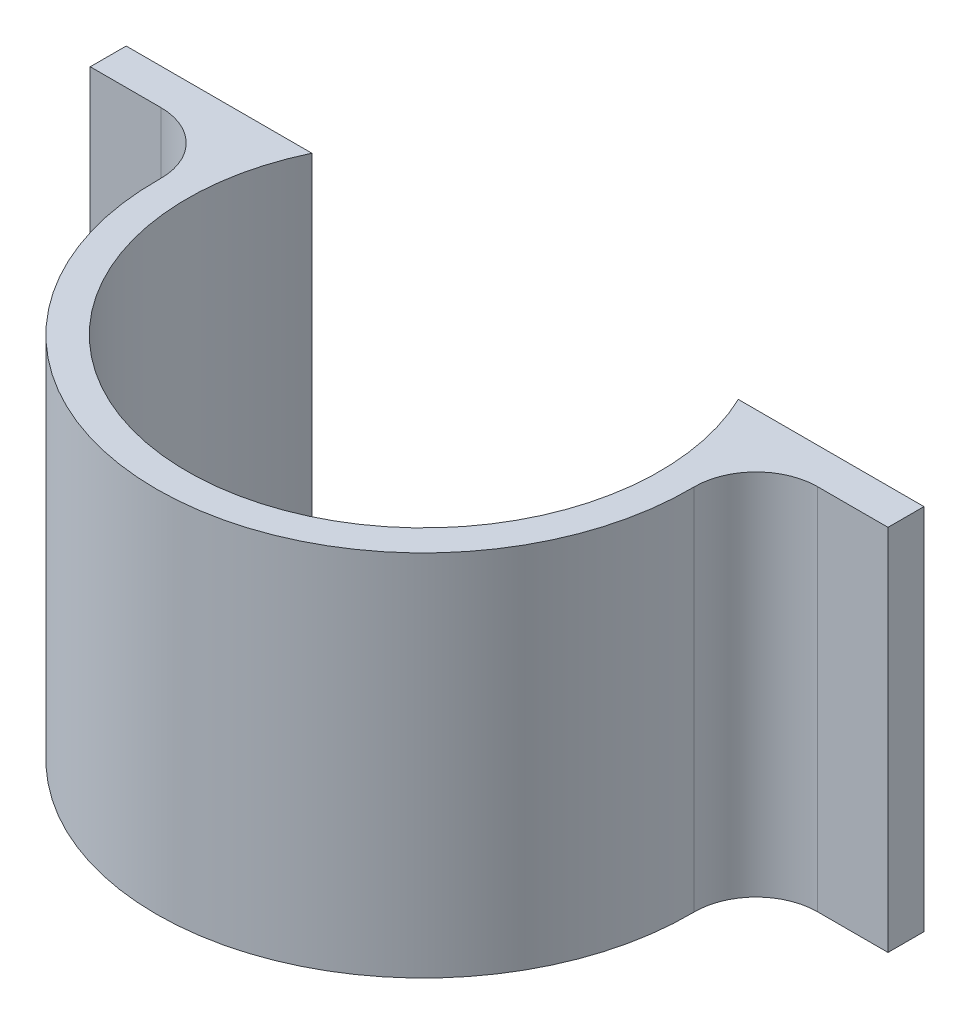
ISO-10303-21;
HEADER;
FILE_DESCRIPTION(('STEP AP214'),'2;1');
FILE_NAME('part.step','',(''),(''),'','','');
FILE_SCHEMA(('AUTOMOTIVE_DESIGN { 1 0 10303 214 1 1 1 1 }'));
ENDSEC;
DATA;
#1=APPLICATION_CONTEXT('core data for automotive mechanical design processes');
#2=APPLICATION_PROTOCOL_DEFINITION('international standard','automotive_design',2000,#1);
#3=PRODUCT_CONTEXT('',#1,'mechanical');
#4=PRODUCT('Part','Part','',(#3));
#5=PRODUCT_RELATED_PRODUCT_CATEGORY('part','',(#4));
#6=PRODUCT_DEFINITION_FORMATION('','',#4);
#7=PRODUCT_DEFINITION_CONTEXT('part definition',#1,'design');
#8=PRODUCT_DEFINITION('design','',#6,#7);
#9=PRODUCT_DEFINITION_SHAPE('','',#8);
#10=(LENGTH_UNIT() NAMED_UNIT(*) SI_UNIT(.MILLI.,.METRE.));
#11=(NAMED_UNIT(*) PLANE_ANGLE_UNIT() SI_UNIT($,.RADIAN.));
#12=(NAMED_UNIT(*) SI_UNIT($,.STERADIAN.) SOLID_ANGLE_UNIT());
#13=UNCERTAINTY_MEASURE_WITH_UNIT(LENGTH_MEASURE(1.E-05),#10,'distance_accuracy_value','');
#14=(GEOMETRIC_REPRESENTATION_CONTEXT(3) GLOBAL_UNCERTAINTY_ASSIGNED_CONTEXT((#13)) GLOBAL_UNIT_ASSIGNED_CONTEXT((#10,
#11,#12)) REPRESENTATION_CONTEXT('',''));
#15=CARTESIAN_POINT('',(0.,0.,0.));
#16=DIRECTION('',(0.,0.,1.));
#17=DIRECTION('',(1.,0.,0.));
#18=AXIS2_PLACEMENT_3D('',#15,#16,#17);
#19=CARTESIAN_POINT('',(0.,60.,-10.7115764139905));
#20=DIRECTION('',(0.,0.,-1.));
#21=DIRECTION('',(-1.,0.,0.));
#22=AXIS2_PLACEMENT_3D('',#19,#20,#21);
#23=PLANE('',#22);
#24=DIRECTION('',(1.,0.,0.));
#25=VECTOR('',#24,1.);
#26=CARTESIAN_POINT('',(0.,0.,-10.7115764139905));
#27=LINE('',#26,#25);
#28=CARTESIAN_POINT('',(-65.,0.,-10.7115764139905));
#29=VERTEX_POINT('',#28);
#30=CARTESIAN_POINT('',(-53.4952676318854,0.,-10.7115764139905));
#31=VERTEX_POINT('',#30);
#32=EDGE_CURVE('E160',#29,#31,#27,.T.);
#33=ORIENTED_EDGE('',*,*,#32,.T.);
#34=DIRECTION('',(0.,1.,0.));
#35=VECTOR('',#34,1.);
#36=CARTESIAN_POINT('',(-53.4952676318854,60.,-10.7115764139905));
#37=LINE('',#36,#35);
#38=CARTESIAN_POINT('',(-53.4952676318854,60.,-10.7115764139905));
#39=VERTEX_POINT('',#38);
#40=EDGE_CURVE('E209',#31,#39,#37,.T.);
#41=ORIENTED_EDGE('',*,*,#40,.T.);
#42=DIRECTION('',(1.,0.,0.));
#43=VECTOR('',#42,1.);
#44=CARTESIAN_POINT('',(0.,60.,-10.7115764139905));
#45=LINE('',#44,#43);
#46=CARTESIAN_POINT('',(-65.,60.,-10.7115764139905));
#47=VERTEX_POINT('',#46);
#48=EDGE_CURVE('E188',#47,#39,#45,.T.);
#49=ORIENTED_EDGE('',*,*,#48,.F.);
#50=DIRECTION('',(0.,-1.,0.));
#51=VECTOR('',#50,1.);
#52=CARTESIAN_POINT('',(-65.,60.,-10.7115764139905));
#53=LINE('',#52,#51);
#54=EDGE_CURVE('E159',#47,#29,#53,.T.);
#55=ORIENTED_EDGE('',*,*,#54,.T.);
#56=EDGE_LOOP('',(#33,#41,#49,#55));
#57=FACE_BOUND('',#56,.T.);
#58=ADVANCED_FACE('F41',(#57),#23,.F.);
#59=CARTESIAN_POINT('',(0.,60.,0.));
#60=DIRECTION('',(0.,-1.,0.));
#61=DIRECTION('',(0.,0.,-1.));
#62=AXIS2_PLACEMENT_3D('',#59,#60,#61);
#63=CYLINDRICAL_SURFACE('',#62,43.5);
#64=CARTESIAN_POINT('',(0.,60.,0.));
#65=DIRECTION('',(0.,1.,0.));
#66=DIRECTION('',(0.,0.,1.));
#67=AXIS2_PLACEMENT_3D('',#64,#65,#66);
#68=CIRCLE('',#67,43.5);
#69=CARTESIAN_POINT('',(-43.4961521866732,60.,-0.578571476796043));
#70=VERTEX_POINT('',#69);
#71=CARTESIAN_POINT('',(43.4961521866732,60.,-0.578571476796059));
#72=VERTEX_POINT('',#71);
#73=EDGE_CURVE('E126',#70,#72,#68,.T.);
#74=ORIENTED_EDGE('',*,*,#73,.F.);
#75=DIRECTION('',(0.,-1.,0.));
#76=VECTOR('',#75,1.);
#77=CARTESIAN_POINT('',(-43.4961521866732,60.,-0.578571476796043));
#78=LINE('',#77,#76);
#79=CARTESIAN_POINT('',(-43.4961521866732,0.,-0.578571476796043));
#80=VERTEX_POINT('',#79);
#81=EDGE_CURVE('E205',#70,#80,#78,.T.);
#82=ORIENTED_EDGE('',*,*,#81,.T.);
#83=CARTESIAN_POINT('',(0.,0.,0.));
#84=DIRECTION('',(0.,1.,0.));
#85=DIRECTION('',(0.,0.,1.));
#86=AXIS2_PLACEMENT_3D('',#83,#84,#85);
#87=CIRCLE('',#86,43.5);
#88=CARTESIAN_POINT('',(43.4961521866732,0.,-0.578571476796059));
#89=VERTEX_POINT('',#88);
#90=EDGE_CURVE('E164',#80,#89,#87,.T.);
#91=ORIENTED_EDGE('',*,*,#90,.T.);
#92=DIRECTION('',(0.,-1.,0.));
#93=VECTOR('',#92,1.);
#94=CARTESIAN_POINT('',(43.4961521866732,60.,-0.578571476796059));
#95=LINE('',#94,#93);
#96=EDGE_CURVE('E137',#89,#72,#95,.F.);
#97=ORIENTED_EDGE('',*,*,#96,.T.);
#98=EDGE_LOOP('',(#74,#82,#91,#97));
#99=FACE_BOUND('',#98,.T.);
#100=ADVANCED_FACE('F227',(#99),#63,.T.);
#101=CARTESIAN_POINT('',(0.,60.,-10.7115764139905));
#102=DIRECTION('',(0.,0.,-1.));
#103=DIRECTION('',(-1.,0.,0.));
#104=AXIS2_PLACEMENT_3D('',#101,#102,#103);
#105=PLANE('',#104);
#106=DIRECTION('',(1.,0.,0.));
#107=VECTOR('',#106,1.);
#108=CARTESIAN_POINT('',(0.,60.,-10.7115764139905));
#109=LINE('',#108,#107);
#110=CARTESIAN_POINT('',(53.4952676318854,60.,-10.7115764139906));
#111=VERTEX_POINT('',#110);
#112=CARTESIAN_POINT('',(65.,60.,-10.7115764139906));
#113=VERTEX_POINT('',#112);
#114=EDGE_CURVE('E116',#111,#113,#109,.T.);
#115=ORIENTED_EDGE('',*,*,#114,.F.);
#116=DIRECTION('',(0.,1.,0.));
#117=VECTOR('',#116,1.);
#118=CARTESIAN_POINT('',(53.4952676318854,0.,-10.7115764139906));
#119=LINE('',#118,#117);
#120=CARTESIAN_POINT('',(53.4952676318854,0.,-10.7115764139906));
#121=VERTEX_POINT('',#120);
#122=EDGE_CURVE('E212',#111,#121,#119,.F.);
#123=ORIENTED_EDGE('',*,*,#122,.T.);
#124=DIRECTION('',(1.,0.,0.));
#125=VECTOR('',#124,1.);
#126=CARTESIAN_POINT('',(0.,0.,-10.7115764139905));
#127=LINE('',#126,#125);
#128=CARTESIAN_POINT('',(65.,0.,-10.7115764139906));
#129=VERTEX_POINT('',#128);
#130=EDGE_CURVE('E132',#121,#129,#127,.T.);
#131=ORIENTED_EDGE('',*,*,#130,.T.);
#132=DIRECTION('',(0.,-1.,0.));
#133=VECTOR('',#132,1.);
#134=CARTESIAN_POINT('',(65.,60.,-10.7115764139906));
#135=LINE('',#134,#133);
#136=EDGE_CURVE('E129',#113,#129,#135,.T.);
#137=ORIENTED_EDGE('',*,*,#136,.F.);
#138=EDGE_LOOP('',(#115,#123,#131,#137));
#139=FACE_BOUND('',#138,.T.);
#140=ADVANCED_FACE('F130',(#139),#105,.F.);
#141=CARTESIAN_POINT('',(65.,60.,0.));
#142=DIRECTION('',(1.,0.,0.));
#143=DIRECTION('',(0.,0.,-1.));
#144=AXIS2_PLACEMENT_3D('',#141,#142,#143);
#145=PLANE('',#144);
#146=DIRECTION('',(0.,0.,1.));
#147=VECTOR('',#146,1.);
#148=CARTESIAN_POINT('',(65.,0.,0.));
#149=LINE('',#148,#147);
#150=CARTESIAN_POINT('',(65.,0.,-16.5682656763163));
#151=VERTEX_POINT('',#150);
#152=EDGE_CURVE('E170',#151,#129,#149,.T.);
#153=ORIENTED_EDGE('',*,*,#152,.F.);
#154=DIRECTION('',(0.,-1.,0.));
#155=VECTOR('',#154,1.);
#156=CARTESIAN_POINT('',(65.,60.,-16.5682656763163));
#157=LINE('',#156,#155);
#158=CARTESIAN_POINT('',(65.,60.,-16.5682656763163));
#159=VERTEX_POINT('',#158);
#160=EDGE_CURVE('E138',#159,#151,#157,.T.);
#161=ORIENTED_EDGE('',*,*,#160,.F.);
#162=DIRECTION('',(0.,0.,1.));
#163=VECTOR('',#162,1.);
#164=CARTESIAN_POINT('',(65.,60.,0.));
#165=LINE('',#164,#163);
#166=EDGE_CURVE('E122',#159,#113,#165,.T.);
#167=ORIENTED_EDGE('',*,*,#166,.T.);
#168=ORIENTED_EDGE('',*,*,#136,.T.);
#169=EDGE_LOOP('',(#153,#161,#167,#168));
#170=FACE_BOUND('',#169,.T.);
#171=ADVANCED_FACE('F140',(#170),#145,.T.);
#172=CARTESIAN_POINT('',(0.,60.,-16.5682656763163));
#173=DIRECTION('',(0.,0.,-1.));
#174=DIRECTION('',(-1.,0.,0.));
#175=AXIS2_PLACEMENT_3D('',#172,#173,#174);
#176=PLANE('',#175);
#177=DIRECTION('',(1.,0.,0.));
#178=VECTOR('',#177,1.);
#179=CARTESIAN_POINT('',(0.,0.,-16.5682656763163));
#180=LINE('',#179,#178);
#181=CARTESIAN_POINT('',(34.7525908743363,0.,-16.5682656763163));
#182=VERTEX_POINT('',#181);
#183=EDGE_CURVE('E173',#182,#151,#180,.T.);
#184=ORIENTED_EDGE('',*,*,#183,.F.);
#185=DIRECTION('',(0.,-1.,0.));
#186=VECTOR('',#185,1.);
#187=CARTESIAN_POINT('',(34.7525908743363,60.,-16.5682656763163));
#188=LINE('',#187,#186);
#189=CARTESIAN_POINT('',(34.7525908743363,60.,-16.5682656763163));
#190=VERTEX_POINT('',#189);
#191=EDGE_CURVE('E198',#190,#182,#188,.T.);
#192=ORIENTED_EDGE('',*,*,#191,.F.);
#193=DIRECTION('',(1.,0.,0.));
#194=VECTOR('',#193,1.);
#195=CARTESIAN_POINT('',(0.,60.,-16.5682656763163));
#196=LINE('',#195,#194);
#197=EDGE_CURVE('E142',#190,#159,#196,.T.);
#198=ORIENTED_EDGE('',*,*,#197,.T.);
#199=ORIENTED_EDGE('',*,*,#160,.T.);
#200=EDGE_LOOP('',(#184,#192,#198,#199));
#201=FACE_BOUND('',#200,.T.);
#202=ADVANCED_FACE('F247',(#201),#176,.T.);
#203=CARTESIAN_POINT('',(0.,60.,0.));
#204=DIRECTION('',(0.,-1.,0.));
#205=DIRECTION('',(0.,0.,-1.));
#206=AXIS2_PLACEMENT_3D('',#203,#204,#205);
#207=CYLINDRICAL_SURFACE('',#206,38.5);
#208=CARTESIAN_POINT('',(0.,0.,0.));
#209=DIRECTION('',(0.,1.,0.));
#210=DIRECTION('',(0.,0.,1.));
#211=AXIS2_PLACEMENT_3D('',#208,#209,#210);
#212=CIRCLE('',#211,38.5);
#213=CARTESIAN_POINT('',(-34.7525908743363,0.,-16.5682656763163));
#214=VERTEX_POINT('',#213);
#215=EDGE_CURVE('E177',#214,#182,#212,.T.);
#216=ORIENTED_EDGE('',*,*,#215,.F.);
#217=DIRECTION('',(0.,-1.,0.));
#218=VECTOR('',#217,1.);
#219=CARTESIAN_POINT('',(-34.7525908743363,60.,-16.5682656763163));
#220=LINE('',#219,#218);
#221=CARTESIAN_POINT('',(-34.7525908743363,60.,-16.5682656763163));
#222=VERTEX_POINT('',#221);
#223=EDGE_CURVE('E195',#222,#214,#220,.T.);
#224=ORIENTED_EDGE('',*,*,#223,.F.);
#225=CARTESIAN_POINT('',(0.,60.,0.));
#226=DIRECTION('',(0.,1.,0.));
#227=DIRECTION('',(0.,0.,1.));
#228=AXIS2_PLACEMENT_3D('',#225,#226,#227);
#229=CIRCLE('',#228,38.5);
#230=EDGE_CURVE('E145',#222,#190,#229,.T.);
#231=ORIENTED_EDGE('',*,*,#230,.T.);
#232=ORIENTED_EDGE('',*,*,#191,.T.);
#233=EDGE_LOOP('',(#216,#224,#231,#232));
#234=FACE_BOUND('',#233,.T.);
#235=ADVANCED_FACE('F250',(#234),#207,.F.);
#236=CARTESIAN_POINT('',(0.,60.,-16.5682656763163));
#237=DIRECTION('',(0.,0.,-1.));
#238=DIRECTION('',(-1.,0.,0.));
#239=AXIS2_PLACEMENT_3D('',#236,#237,#238);
#240=PLANE('',#239);
#241=DIRECTION('',(1.,0.,0.));
#242=VECTOR('',#241,1.);
#243=CARTESIAN_POINT('',(0.,0.,-16.5682656763163));
#244=LINE('',#243,#242);
#245=CARTESIAN_POINT('',(-65.,0.,-16.5682656763163));
#246=VERTEX_POINT('',#245);
#247=EDGE_CURVE('E181',#246,#214,#244,.T.);
#248=ORIENTED_EDGE('',*,*,#247,.F.);
#249=DIRECTION('',(0.,-1.,0.));
#250=VECTOR('',#249,1.);
#251=CARTESIAN_POINT('',(-65.,60.,-16.5682656763163));
#252=LINE('',#251,#250);
#253=CARTESIAN_POINT('',(-65.,60.,-16.5682656763163));
#254=VERTEX_POINT('',#253);
#255=EDGE_CURVE('E192',#254,#246,#252,.T.);
#256=ORIENTED_EDGE('',*,*,#255,.F.);
#257=DIRECTION('',(1.,0.,0.));
#258=VECTOR('',#257,1.);
#259=CARTESIAN_POINT('',(0.,60.,-16.5682656763163));
#260=LINE('',#259,#258);
#261=EDGE_CURVE('E152',#254,#222,#260,.T.);
#262=ORIENTED_EDGE('',*,*,#261,.T.);
#263=ORIENTED_EDGE('',*,*,#223,.T.);
#264=EDGE_LOOP('',(#248,#256,#262,#263));
#265=FACE_BOUND('',#264,.T.);
#266=ADVANCED_FACE('F254',(#265),#240,.T.);
#267=CARTESIAN_POINT('',(-65.,60.,0.));
#268=DIRECTION('',(1.,0.,0.));
#269=DIRECTION('',(0.,0.,-1.));
#270=AXIS2_PLACEMENT_3D('',#267,#268,#269);
#271=PLANE('',#270);
#272=DIRECTION('',(0.,0.,1.));
#273=VECTOR('',#272,1.);
#274=CARTESIAN_POINT('',(-65.,0.,0.));
#275=LINE('',#274,#273);
#276=EDGE_CURVE('E185',#246,#29,#275,.T.);
#277=ORIENTED_EDGE('',*,*,#276,.T.);
#278=ORIENTED_EDGE('',*,*,#54,.F.);
#279=DIRECTION('',(0.,0.,1.));
#280=VECTOR('',#279,1.);
#281=CARTESIAN_POINT('',(-65.,60.,0.));
#282=LINE('',#281,#280);
#283=EDGE_CURVE('E156',#254,#47,#282,.T.);
#284=ORIENTED_EDGE('',*,*,#283,.F.);
#285=ORIENTED_EDGE('',*,*,#255,.T.);
#286=EDGE_LOOP('',(#277,#278,#284,#285));
#287=FACE_BOUND('',#286,.T.);
#288=ADVANCED_FACE('F258',(#287),#271,.F.);
#289=CARTESIAN_POINT('',(0.,60.,0.));
#290=DIRECTION('',(0.,1.,0.));
#291=DIRECTION('',(0.,0.,1.));
#292=AXIS2_PLACEMENT_3D('',#289,#290,#291);
#293=PLANE('',#292);
#294=ORIENTED_EDGE('',*,*,#48,.T.);
#295=CARTESIAN_POINT('',(-53.4952676318854,60.,-0.711576413990535));
#296=DIRECTION('',(0.,1.,0.));
#297=DIRECTION('',(0.,0.,1.));
#298=AXIS2_PLACEMENT_3D('',#295,#296,#297);
#299=CIRCLE('',#298,10.);
#300=EDGE_CURVE('E218',#39,#70,#299,.F.);
#301=ORIENTED_EDGE('',*,*,#300,.T.);
#302=ORIENTED_EDGE('',*,*,#73,.T.);
#303=CARTESIAN_POINT('',(53.4952676318854,60.,-0.711576413990555));
#304=DIRECTION('',(0.,1.,0.));
#305=DIRECTION('',(0.,0.,1.));
#306=AXIS2_PLACEMENT_3D('',#303,#304,#305);
#307=CIRCLE('',#306,10.);
#308=EDGE_CURVE('E11',#72,#111,#307,.F.);
#309=ORIENTED_EDGE('',*,*,#308,.T.);
#310=ORIENTED_EDGE('',*,*,#114,.T.);
#311=ORIENTED_EDGE('',*,*,#166,.F.);
#312=ORIENTED_EDGE('',*,*,#197,.F.);
#313=ORIENTED_EDGE('',*,*,#230,.F.);
#314=ORIENTED_EDGE('',*,*,#261,.F.);
#315=ORIENTED_EDGE('',*,*,#283,.T.);
#316=EDGE_LOOP('',(#294,#301,#302,#309,#310,#311,#312,#313,#314,#315));
#317=FACE_BOUND('',#316,.T.);
#318=ADVANCED_FACE('F119',(#317),#293,.T.);
#319=CARTESIAN_POINT('',(0.,0.,0.));
#320=DIRECTION('',(0.,1.,0.));
#321=DIRECTION('',(0.,0.,1.));
#322=AXIS2_PLACEMENT_3D('',#319,#320,#321);
#323=PLANE('',#322);
#324=ORIENTED_EDGE('',*,*,#32,.F.);
#325=ORIENTED_EDGE('',*,*,#276,.F.);
#326=ORIENTED_EDGE('',*,*,#247,.T.);
#327=ORIENTED_EDGE('',*,*,#215,.T.);
#328=ORIENTED_EDGE('',*,*,#183,.T.);
#329=ORIENTED_EDGE('',*,*,#152,.T.);
#330=ORIENTED_EDGE('',*,*,#130,.F.);
#331=CARTESIAN_POINT('',(53.4952676318854,0.,-0.711576413990555));
#332=DIRECTION('',(0.,1.,0.));
#333=DIRECTION('',(0.,0.,1.));
#334=AXIS2_PLACEMENT_3D('',#331,#332,#333);
#335=CIRCLE('',#334,10.);
#336=EDGE_CURVE('E50',#121,#89,#335,.T.);
#337=ORIENTED_EDGE('',*,*,#336,.T.);
#338=ORIENTED_EDGE('',*,*,#90,.F.);
#339=CARTESIAN_POINT('',(-53.4952676318854,0.,-0.711576413990535));
#340=DIRECTION('',(0.,1.,0.));
#341=DIRECTION('',(0.,0.,1.));
#342=AXIS2_PLACEMENT_3D('',#339,#340,#341);
#343=CIRCLE('',#342,10.);
#344=EDGE_CURVE('E215',#80,#31,#343,.T.);
#345=ORIENTED_EDGE('',*,*,#344,.T.);
#346=EDGE_LOOP('',(#324,#325,#326,#327,#328,#329,#330,#337,#338,#345));
#347=FACE_BOUND('',#346,.T.);
#348=ADVANCED_FACE('F224',(#347),#323,.F.);
#349=CARTESIAN_POINT('',(-53.4952676318854,60.,-0.711576413990535));
#350=DIRECTION('',(0.,-1.,0.));
#351=DIRECTION('',(0.,0.,-1.));
#352=AXIS2_PLACEMENT_3D('',#349,#350,#351);
#353=CYLINDRICAL_SURFACE('',#352,10.);
#354=ORIENTED_EDGE('',*,*,#300,.F.);
#355=ORIENTED_EDGE('',*,*,#40,.F.);
#356=ORIENTED_EDGE('',*,*,#344,.F.);
#357=ORIENTED_EDGE('',*,*,#81,.F.);
#358=EDGE_LOOP('',(#354,#355,#356,#357));
#359=FACE_BOUND('',#358,.T.);
#360=ADVANCED_FACE('F230',(#359),#353,.F.);
#361=CARTESIAN_POINT('',(53.4952676318854,60.,-0.711576413990555));
#362=DIRECTION('',(0.,-1.,0.));
#363=DIRECTION('',(0.,0.,-1.));
#364=AXIS2_PLACEMENT_3D('',#361,#362,#363);
#365=CYLINDRICAL_SURFACE('',#364,10.);
#366=ORIENTED_EDGE('',*,*,#308,.F.);
#367=ORIENTED_EDGE('',*,*,#96,.F.);
#368=ORIENTED_EDGE('',*,*,#336,.F.);
#369=ORIENTED_EDGE('',*,*,#122,.F.);
#370=EDGE_LOOP('',(#366,#367,#368,#369));
#371=FACE_BOUND('',#370,.T.);
#372=ADVANCED_FACE('F43',(#371),#365,.F.);
#373=CLOSED_SHELL('',(#58,#100,#140,#171,#202,#235,#266,#288,#318,#348,#360,#372));
#374=MANIFOLD_SOLID_BREP('B2',#373);
#375=ADVANCED_BREP_SHAPE_REPRESENTATION('',(#18,#374),#14);
#376=SHAPE_DEFINITION_REPRESENTATION(#9,#375);
ENDSEC;
END-ISO-10303-21;
